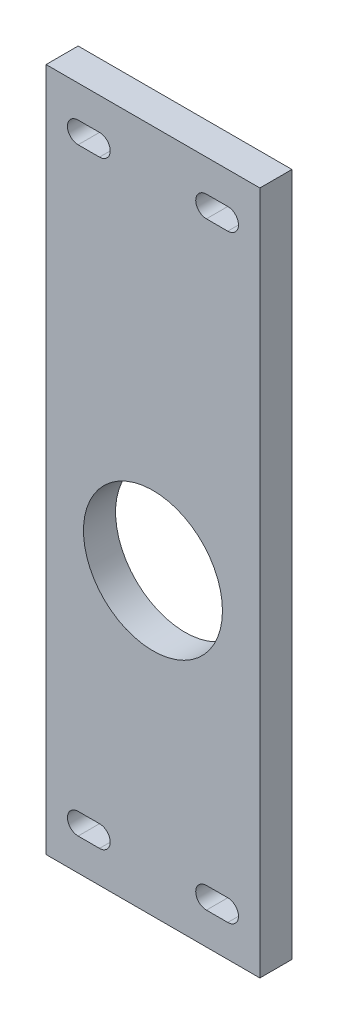
ISO-10303-21;
HEADER;
FILE_DESCRIPTION(('STEP AP214'),'2;1');
FILE_NAME('part.step','',(''),(''),'','','');
FILE_SCHEMA(('AUTOMOTIVE_DESIGN { 1 0 10303 214 1 1 1 1 }'));
ENDSEC;
DATA;
#1=APPLICATION_CONTEXT('core data for automotive mechanical design processes');
#2=APPLICATION_PROTOCOL_DEFINITION('international standard','automotive_design',2000,#1);
#3=PRODUCT_CONTEXT('',#1,'mechanical');
#4=PRODUCT('Part','Part','',(#3));
#5=PRODUCT_RELATED_PRODUCT_CATEGORY('part','',(#4));
#6=PRODUCT_DEFINITION_FORMATION('','',#4);
#7=PRODUCT_DEFINITION_CONTEXT('part definition',#1,'design');
#8=PRODUCT_DEFINITION('design','',#6,#7);
#9=PRODUCT_DEFINITION_SHAPE('','',#8);
#10=(LENGTH_UNIT() NAMED_UNIT(*) SI_UNIT(.MILLI.,.METRE.));
#11=(NAMED_UNIT(*) PLANE_ANGLE_UNIT() SI_UNIT($,.RADIAN.));
#12=(NAMED_UNIT(*) SI_UNIT($,.STERADIAN.) SOLID_ANGLE_UNIT());
#13=UNCERTAINTY_MEASURE_WITH_UNIT(LENGTH_MEASURE(1.E-05),#10,'distance_accuracy_value','');
#14=(GEOMETRIC_REPRESENTATION_CONTEXT(3) GLOBAL_UNCERTAINTY_ASSIGNED_CONTEXT((#13)) GLOBAL_UNIT_ASSIGNED_CONTEXT((#10,
#11,#12)) REPRESENTATION_CONTEXT('',''));
#15=CARTESIAN_POINT('',(0.,0.,0.));
#16=DIRECTION('',(0.,0.,1.));
#17=DIRECTION('',(1.,0.,0.));
#18=AXIS2_PLACEMENT_3D('',#15,#16,#17);
#19=CARTESIAN_POINT('',(15.875,-92.075,0.));
#20=DIRECTION('',(0.,-1.,0.));
#21=DIRECTION('',(0.,0.,-1.));
#22=AXIS2_PLACEMENT_3D('',#19,#20,#21);
#23=PLANE('',#22);
#24=DIRECTION('',(1.,0.,0.));
#25=VECTOR('',#24,1.);
#26=CARTESIAN_POINT('',(15.875,-92.075,9.525));
#27=LINE('',#26,#25);
#28=CARTESIAN_POINT('',(15.875,-92.075,9.525));
#29=VERTEX_POINT('',#28);
#30=CARTESIAN_POINT('',(22.225,-92.075,9.525));
#31=VERTEX_POINT('',#30);
#32=EDGE_CURVE('E314',#29,#31,#27,.T.);
#33=ORIENTED_EDGE('',*,*,#32,.T.);
#34=DIRECTION('',(0.,0.,1.));
#35=VECTOR('',#34,1.);
#36=CARTESIAN_POINT('',(22.225,-92.075,0.));
#37=LINE('',#36,#35);
#38=CARTESIAN_POINT('',(22.225,-92.075,0.));
#39=VERTEX_POINT('',#38);
#40=EDGE_CURVE('E11',#39,#31,#37,.T.);
#41=ORIENTED_EDGE('',*,*,#40,.F.);
#42=DIRECTION('',(1.,0.,0.));
#43=VECTOR('',#42,1.);
#44=CARTESIAN_POINT('',(15.875,-92.075,0.));
#45=LINE('',#44,#43);
#46=CARTESIAN_POINT('',(15.875,-92.075,0.));
#47=VERTEX_POINT('',#46);
#48=EDGE_CURVE('E318',#47,#39,#45,.T.);
#49=ORIENTED_EDGE('',*,*,#48,.F.);
#50=DIRECTION('',(0.,0.,1.));
#51=VECTOR('',#50,1.);
#52=CARTESIAN_POINT('',(15.875,-92.075,0.));
#53=LINE('',#52,#51);
#54=EDGE_CURVE('E323',#47,#29,#53,.T.);
#55=ORIENTED_EDGE('',*,*,#54,.T.);
#56=EDGE_LOOP('',(#33,#41,#49,#55));
#57=FACE_BOUND('',#56,.T.);
#58=ADVANCED_FACE('F32',(#57),#23,.F.);
#59=CARTESIAN_POINT('',(22.225,-88.9,0.));
#60=DIRECTION('',(0.,0.,1.));
#61=DIRECTION('',(1.,0.,0.));
#62=AXIS2_PLACEMENT_3D('',#59,#60,#61);
#63=CYLINDRICAL_SURFACE('',#62,3.175);
#64=CARTESIAN_POINT('',(22.225,-88.9,9.525));
#65=DIRECTION('',(0.,0.,1.));
#66=DIRECTION('',(1.,0.,0.));
#67=AXIS2_PLACEMENT_3D('',#64,#65,#66);
#68=CIRCLE('',#67,3.175);
#69=CARTESIAN_POINT('',(22.225,-85.725,9.525));
#70=VERTEX_POINT('',#69);
#71=EDGE_CURVE('E311',#31,#70,#68,.T.);
#72=ORIENTED_EDGE('',*,*,#71,.T.);
#73=DIRECTION('',(0.,0.,1.));
#74=VECTOR('',#73,1.);
#75=CARTESIAN_POINT('',(22.225,-85.725,0.));
#76=LINE('',#75,#74);
#77=CARTESIAN_POINT('',(22.225,-85.725,0.));
#78=VERTEX_POINT('',#77);
#79=EDGE_CURVE('E39',#78,#70,#76,.T.);
#80=ORIENTED_EDGE('',*,*,#79,.F.);
#81=CARTESIAN_POINT('',(22.225,-88.9,0.));
#82=DIRECTION('',(0.,0.,1.));
#83=DIRECTION('',(1.,0.,0.));
#84=AXIS2_PLACEMENT_3D('',#81,#82,#83);
#85=CIRCLE('',#84,3.175);
#86=EDGE_CURVE('E53',#39,#78,#85,.T.);
#87=ORIENTED_EDGE('',*,*,#86,.F.);
#88=ORIENTED_EDGE('',*,*,#40,.T.);
#89=EDGE_LOOP('',(#72,#80,#87,#88));
#90=FACE_BOUND('',#89,.T.);
#91=ADVANCED_FACE('F333',(#90),#63,.F.);
#92=CARTESIAN_POINT('',(15.875,-85.725,0.));
#93=DIRECTION('',(0.,1.,0.));
#94=DIRECTION('',(0.,0.,1.));
#95=AXIS2_PLACEMENT_3D('',#92,#93,#94);
#96=PLANE('',#95);
#97=DIRECTION('',(-1.,0.,0.));
#98=VECTOR('',#97,1.);
#99=CARTESIAN_POINT('',(15.875,-85.725,9.525));
#100=LINE('',#99,#98);
#101=CARTESIAN_POINT('',(15.875,-85.725,9.525));
#102=VERTEX_POINT('',#101);
#103=EDGE_CURVE('E308',#70,#102,#100,.T.);
#104=ORIENTED_EDGE('',*,*,#103,.T.);
#105=DIRECTION('',(0.,0.,1.));
#106=VECTOR('',#105,1.);
#107=CARTESIAN_POINT('',(15.875,-85.725,0.));
#108=LINE('',#107,#106);
#109=CARTESIAN_POINT('',(15.875,-85.725,0.));
#110=VERTEX_POINT('',#109);
#111=EDGE_CURVE('E326',#110,#102,#108,.T.);
#112=ORIENTED_EDGE('',*,*,#111,.F.);
#113=DIRECTION('',(-1.,0.,0.));
#114=VECTOR('',#113,1.);
#115=CARTESIAN_POINT('',(15.875,-85.725,0.));
#116=LINE('',#115,#114);
#117=EDGE_CURVE('E321',#78,#110,#116,.T.);
#118=ORIENTED_EDGE('',*,*,#117,.F.);
#119=ORIENTED_EDGE('',*,*,#79,.T.);
#120=EDGE_LOOP('',(#104,#112,#118,#119));
#121=FACE_BOUND('',#120,.T.);
#122=ADVANCED_FACE('F330',(#121),#96,.F.);
#123=CARTESIAN_POINT('',(15.875,-88.9,0.));
#124=DIRECTION('',(0.,0.,1.));
#125=DIRECTION('',(1.,0.,0.));
#126=AXIS2_PLACEMENT_3D('',#123,#124,#125);
#127=CYLINDRICAL_SURFACE('',#126,3.175);
#128=CARTESIAN_POINT('',(15.875,-88.9,9.525));
#129=DIRECTION('',(0.,0.,1.));
#130=DIRECTION('',(1.,0.,0.));
#131=AXIS2_PLACEMENT_3D('',#128,#129,#130);
#132=CIRCLE('',#131,3.175);
#133=EDGE_CURVE('E306',#102,#29,#132,.T.);
#134=ORIENTED_EDGE('',*,*,#133,.T.);
#135=ORIENTED_EDGE('',*,*,#54,.F.);
#136=CARTESIAN_POINT('',(15.875,-88.9,0.));
#137=DIRECTION('',(0.,0.,1.));
#138=DIRECTION('',(1.,0.,0.));
#139=AXIS2_PLACEMENT_3D('',#136,#137,#138);
#140=CIRCLE('',#139,3.175);
#141=EDGE_CURVE('E46',#110,#47,#140,.T.);
#142=ORIENTED_EDGE('',*,*,#141,.F.);
#143=ORIENTED_EDGE('',*,*,#111,.T.);
#144=EDGE_LOOP('',(#134,#135,#142,#143));
#145=FACE_BOUND('',#144,.T.);
#146=ADVANCED_FACE('F339',(#145),#127,.F.);
#147=CARTESIAN_POINT('',(-22.225,-92.075,0.));
#148=DIRECTION('',(0.,-1.,0.));
#149=DIRECTION('',(0.,0.,-1.));
#150=AXIS2_PLACEMENT_3D('',#147,#148,#149);
#151=PLANE('',#150);
#152=DIRECTION('',(1.,0.,0.));
#153=VECTOR('',#152,1.);
#154=CARTESIAN_POINT('',(-22.225,-92.075,9.525));
#155=LINE('',#154,#153);
#156=CARTESIAN_POINT('',(-22.225,-92.075,9.525));
#157=VERTEX_POINT('',#156);
#158=CARTESIAN_POINT('',(-15.875,-92.075,9.525));
#159=VERTEX_POINT('',#158);
#160=EDGE_CURVE('E282',#157,#159,#155,.T.);
#161=ORIENTED_EDGE('',*,*,#160,.T.);
#162=DIRECTION('',(0.,0.,1.));
#163=VECTOR('',#162,1.);
#164=CARTESIAN_POINT('',(-15.875,-92.075,0.));
#165=LINE('',#164,#163);
#166=CARTESIAN_POINT('',(-15.875,-92.075,0.));
#167=VERTEX_POINT('',#166);
#168=EDGE_CURVE('E303',#167,#159,#165,.T.);
#169=ORIENTED_EDGE('',*,*,#168,.F.);
#170=DIRECTION('',(1.,0.,0.));
#171=VECTOR('',#170,1.);
#172=CARTESIAN_POINT('',(-22.225,-92.075,0.));
#173=LINE('',#172,#171);
#174=CARTESIAN_POINT('',(-22.225,-92.075,0.));
#175=VERTEX_POINT('',#174);
#176=EDGE_CURVE('E287',#175,#167,#173,.T.);
#177=ORIENTED_EDGE('',*,*,#176,.F.);
#178=DIRECTION('',(0.,0.,1.));
#179=VECTOR('',#178,1.);
#180=CARTESIAN_POINT('',(-22.225,-92.075,0.));
#181=LINE('',#180,#179);
#182=EDGE_CURVE('E294',#175,#157,#181,.T.);
#183=ORIENTED_EDGE('',*,*,#182,.T.);
#184=EDGE_LOOP('',(#161,#169,#177,#183));
#185=FACE_BOUND('',#184,.T.);
#186=ADVANCED_FACE('F341',(#185),#151,.F.);
#187=CARTESIAN_POINT('',(-15.875,-88.9,0.));
#188=DIRECTION('',(0.,0.,1.));
#189=DIRECTION('',(1.,0.,0.));
#190=AXIS2_PLACEMENT_3D('',#187,#188,#189);
#191=CYLINDRICAL_SURFACE('',#190,3.175);
#192=CARTESIAN_POINT('',(-15.875,-88.9,9.525));
#193=DIRECTION('',(0.,0.,1.));
#194=DIRECTION('',(1.,0.,0.));
#195=AXIS2_PLACEMENT_3D('',#192,#193,#194);
#196=CIRCLE('',#195,3.175);
#197=CARTESIAN_POINT('',(-15.875,-85.725,9.525));
#198=VERTEX_POINT('',#197);
#199=EDGE_CURVE('E279',#159,#198,#196,.T.);
#200=ORIENTED_EDGE('',*,*,#199,.T.);
#201=DIRECTION('',(0.,0.,1.));
#202=VECTOR('',#201,1.);
#203=CARTESIAN_POINT('',(-15.875,-85.725,0.));
#204=LINE('',#203,#202);
#205=CARTESIAN_POINT('',(-15.875,-85.725,0.));
#206=VERTEX_POINT('',#205);
#207=EDGE_CURVE('E300',#206,#198,#204,.T.);
#208=ORIENTED_EDGE('',*,*,#207,.F.);
#209=CARTESIAN_POINT('',(-15.875,-88.9,0.));
#210=DIRECTION('',(0.,0.,1.));
#211=DIRECTION('',(1.,0.,0.));
#212=AXIS2_PLACEMENT_3D('',#209,#210,#211);
#213=CIRCLE('',#212,3.175);
#214=EDGE_CURVE('E289',#167,#206,#213,.T.);
#215=ORIENTED_EDGE('',*,*,#214,.F.);
#216=ORIENTED_EDGE('',*,*,#168,.T.);
#217=EDGE_LOOP('',(#200,#208,#215,#216));
#218=FACE_BOUND('',#217,.T.);
#219=ADVANCED_FACE('F347',(#218),#191,.F.);
#220=CARTESIAN_POINT('',(-22.225,-85.725,0.));
#221=DIRECTION('',(0.,1.,0.));
#222=DIRECTION('',(0.,0.,1.));
#223=AXIS2_PLACEMENT_3D('',#220,#221,#222);
#224=PLANE('',#223);
#225=DIRECTION('',(-1.,0.,0.));
#226=VECTOR('',#225,1.);
#227=CARTESIAN_POINT('',(-22.225,-85.725,9.525));
#228=LINE('',#227,#226);
#229=CARTESIAN_POINT('',(-22.225,-85.725,9.525));
#230=VERTEX_POINT('',#229);
#231=EDGE_CURVE('E276',#198,#230,#228,.T.);
#232=ORIENTED_EDGE('',*,*,#231,.T.);
#233=DIRECTION('',(0.,0.,1.));
#234=VECTOR('',#233,1.);
#235=CARTESIAN_POINT('',(-22.225,-85.725,0.));
#236=LINE('',#235,#234);
#237=CARTESIAN_POINT('',(-22.225,-85.725,0.));
#238=VERTEX_POINT('',#237);
#239=EDGE_CURVE('E297',#238,#230,#236,.T.);
#240=ORIENTED_EDGE('',*,*,#239,.F.);
#241=DIRECTION('',(-1.,0.,0.));
#242=VECTOR('',#241,1.);
#243=CARTESIAN_POINT('',(-22.225,-85.725,0.));
#244=LINE('',#243,#242);
#245=EDGE_CURVE('E291',#206,#238,#244,.T.);
#246=ORIENTED_EDGE('',*,*,#245,.F.);
#247=ORIENTED_EDGE('',*,*,#207,.T.);
#248=EDGE_LOOP('',(#232,#240,#246,#247));
#249=FACE_BOUND('',#248,.T.);
#250=ADVANCED_FACE('F380',(#249),#224,.F.);
#251=CARTESIAN_POINT('',(-22.225,-88.9,0.));
#252=DIRECTION('',(0.,0.,1.));
#253=DIRECTION('',(1.,0.,0.));
#254=AXIS2_PLACEMENT_3D('',#251,#252,#253);
#255=CYLINDRICAL_SURFACE('',#254,3.175);
#256=CARTESIAN_POINT('',(-22.225,-88.9,9.525));
#257=DIRECTION('',(0.,0.,1.));
#258=DIRECTION('',(1.,0.,0.));
#259=AXIS2_PLACEMENT_3D('',#256,#257,#258);
#260=CIRCLE('',#259,3.175);
#261=EDGE_CURVE('E274',#230,#157,#260,.T.);
#262=ORIENTED_EDGE('',*,*,#261,.T.);
#263=ORIENTED_EDGE('',*,*,#182,.F.);
#264=CARTESIAN_POINT('',(-22.225,-88.9,0.));
#265=DIRECTION('',(0.,0.,1.));
#266=DIRECTION('',(1.,0.,0.));
#267=AXIS2_PLACEMENT_3D('',#264,#265,#266);
#268=CIRCLE('',#267,3.175);
#269=EDGE_CURVE('E285',#238,#175,#268,.T.);
#270=ORIENTED_EDGE('',*,*,#269,.F.);
#271=ORIENTED_EDGE('',*,*,#239,.T.);
#272=EDGE_LOOP('',(#262,#263,#270,#271));
#273=FACE_BOUND('',#272,.T.);
#274=ADVANCED_FACE('F390',(#273),#255,.F.);
#275=CARTESIAN_POINT('',(31.75,101.6,9.525));
#276=DIRECTION('',(-1.,0.,0.));
#277=DIRECTION('',(0.,-1.,0.));
#278=AXIS2_PLACEMENT_3D('',#275,#276,#277);
#279=PLANE('',#278);
#280=DIRECTION('',(0.,1.,0.));
#281=VECTOR('',#280,1.);
#282=CARTESIAN_POINT('',(31.75,101.6,0.));
#283=LINE('',#282,#281);
#284=CARTESIAN_POINT('',(31.75,-101.6,0.));
#285=VERTEX_POINT('',#284);
#286=CARTESIAN_POINT('',(31.75,101.6,0.));
#287=VERTEX_POINT('',#286);
#288=EDGE_CURVE('E238',#285,#287,#283,.T.);
#289=ORIENTED_EDGE('',*,*,#288,.T.);
#290=DIRECTION('',(0.,0.,-1.));
#291=VECTOR('',#290,1.);
#292=CARTESIAN_POINT('',(31.75,101.6,9.525));
#293=LINE('',#292,#291);
#294=CARTESIAN_POINT('',(31.75,101.6,9.525));
#295=VERTEX_POINT('',#294);
#296=EDGE_CURVE('E271',#295,#287,#293,.T.);
#297=ORIENTED_EDGE('',*,*,#296,.F.);
#298=DIRECTION('',(0.,1.,0.));
#299=VECTOR('',#298,1.);
#300=CARTESIAN_POINT('',(31.75,101.6,9.525));
#301=LINE('',#300,#299);
#302=CARTESIAN_POINT('',(31.75,-101.6,9.525));
#303=VERTEX_POINT('',#302);
#304=EDGE_CURVE('E245',#303,#295,#301,.T.);
#305=ORIENTED_EDGE('',*,*,#304,.F.);
#306=DIRECTION('',(0.,0.,-1.));
#307=VECTOR('',#306,1.);
#308=CARTESIAN_POINT('',(31.75,-101.6,9.525));
#309=LINE('',#308,#307);
#310=EDGE_CURVE('E255',#303,#285,#309,.T.);
#311=ORIENTED_EDGE('',*,*,#310,.T.);
#312=EDGE_LOOP('',(#289,#297,#305,#311));
#313=FACE_BOUND('',#312,.T.);
#314=ADVANCED_FACE('F400',(#313),#279,.F.);
#315=CARTESIAN_POINT('',(-31.75,101.6,9.525));
#316=DIRECTION('',(0.,-1.,0.));
#317=DIRECTION('',(0.,0.,-1.));
#318=AXIS2_PLACEMENT_3D('',#315,#316,#317);
#319=PLANE('',#318);
#320=DIRECTION('',(-1.,0.,0.));
#321=VECTOR('',#320,1.);
#322=CARTESIAN_POINT('',(-31.75,101.6,0.));
#323=LINE('',#322,#321);
#324=CARTESIAN_POINT('',(-31.75,101.6,0.));
#325=VERTEX_POINT('',#324);
#326=EDGE_CURVE('E258',#287,#325,#323,.T.);
#327=ORIENTED_EDGE('',*,*,#326,.T.);
#328=DIRECTION('',(0.,0.,-1.));
#329=VECTOR('',#328,1.);
#330=CARTESIAN_POINT('',(-31.75,101.6,9.525));
#331=LINE('',#330,#329);
#332=CARTESIAN_POINT('',(-31.75,101.6,9.525));
#333=VERTEX_POINT('',#332);
#334=EDGE_CURVE('E268',#333,#325,#331,.T.);
#335=ORIENTED_EDGE('',*,*,#334,.F.);
#336=DIRECTION('',(-1.,0.,0.));
#337=VECTOR('',#336,1.);
#338=CARTESIAN_POINT('',(-31.75,101.6,9.525));
#339=LINE('',#338,#337);
#340=EDGE_CURVE('E248',#295,#333,#339,.T.);
#341=ORIENTED_EDGE('',*,*,#340,.F.);
#342=ORIENTED_EDGE('',*,*,#296,.T.);
#343=EDGE_LOOP('',(#327,#335,#341,#342));
#344=FACE_BOUND('',#343,.T.);
#345=ADVANCED_FACE('F499',(#344),#319,.F.);
#346=CARTESIAN_POINT('',(-31.75,101.6,9.525));
#347=DIRECTION('',(1.,0.,0.));
#348=DIRECTION('',(0.,1.,0.));
#349=AXIS2_PLACEMENT_3D('',#346,#347,#348);
#350=PLANE('',#349);
#351=DIRECTION('',(0.,-1.,0.));
#352=VECTOR('',#351,1.);
#353=CARTESIAN_POINT('',(-31.75,101.6,0.));
#354=LINE('',#353,#352);
#355=CARTESIAN_POINT('',(-31.75,-101.6,0.));
#356=VERTEX_POINT('',#355);
#357=EDGE_CURVE('E260',#325,#356,#354,.T.);
#358=ORIENTED_EDGE('',*,*,#357,.T.);
#359=DIRECTION('',(0.,0.,-1.));
#360=VECTOR('',#359,1.);
#361=CARTESIAN_POINT('',(-31.75,-101.6,9.525));
#362=LINE('',#361,#360);
#363=CARTESIAN_POINT('',(-31.75,-101.6,9.525));
#364=VERTEX_POINT('',#363);
#365=EDGE_CURVE('E265',#364,#356,#362,.T.);
#366=ORIENTED_EDGE('',*,*,#365,.F.);
#367=DIRECTION('',(0.,-1.,0.));
#368=VECTOR('',#367,1.);
#369=CARTESIAN_POINT('',(-31.75,101.6,9.525));
#370=LINE('',#369,#368);
#371=EDGE_CURVE('E251',#333,#364,#370,.T.);
#372=ORIENTED_EDGE('',*,*,#371,.F.);
#373=ORIENTED_EDGE('',*,*,#334,.T.);
#374=EDGE_LOOP('',(#358,#366,#372,#373));
#375=FACE_BOUND('',#374,.T.);
#376=ADVANCED_FACE('F495',(#375),#350,.F.);
#377=CARTESIAN_POINT('',(-31.75,-101.6,9.525));
#378=DIRECTION('',(0.,1.,0.));
#379=DIRECTION('',(0.,0.,1.));
#380=AXIS2_PLACEMENT_3D('',#377,#378,#379);
#381=PLANE('',#380);
#382=DIRECTION('',(1.,0.,0.));
#383=VECTOR('',#382,1.);
#384=CARTESIAN_POINT('',(-31.75,-101.6,0.));
#385=LINE('',#384,#383);
#386=EDGE_CURVE('E249',#356,#285,#385,.T.);
#387=ORIENTED_EDGE('',*,*,#386,.T.);
#388=ORIENTED_EDGE('',*,*,#310,.F.);
#389=DIRECTION('',(1.,0.,0.));
#390=VECTOR('',#389,1.);
#391=CARTESIAN_POINT('',(-31.75,-101.6,9.525));
#392=LINE('',#391,#390);
#393=EDGE_CURVE('E253',#364,#303,#392,.T.);
#394=ORIENTED_EDGE('',*,*,#393,.F.);
#395=ORIENTED_EDGE('',*,*,#365,.T.);
#396=EDGE_LOOP('',(#387,#388,#394,#395));
#397=FACE_BOUND('',#396,.T.);
#398=ADVANCED_FACE('F453',(#397),#381,.F.);
#399=CARTESIAN_POINT('',(0.,0.,9.525));
#400=DIRECTION('',(0.,0.,1.));
#401=DIRECTION('',(1.,0.,0.));
#402=AXIS2_PLACEMENT_3D('',#399,#400,#401);
#403=PLANE('',#402);
#404=CARTESIAN_POINT('',(0.,-12.7,9.525));
#405=DIRECTION('',(0.,0.,1.));
#406=DIRECTION('',(1.,0.,0.));
#407=AXIS2_PLACEMENT_3D('',#404,#405,#406);
#408=CIRCLE('',#407,20.6375);
#409=CARTESIAN_POINT('',(20.6375,-12.7,9.525));
#410=VERTEX_POINT('',#409);
#411=EDGE_CURVE('E591',#410,#410,#408,.T.);
#412=ORIENTED_EDGE('',*,*,#411,.F.);
#413=EDGE_LOOP('',(#412));
#414=FACE_BOUND('',#413,.T.);
#415=CARTESIAN_POINT('',(15.875,88.9,9.525));
#416=DIRECTION('',(0.,0.,1.));
#417=DIRECTION('',(1.,0.,0.));
#418=AXIS2_PLACEMENT_3D('',#415,#416,#417);
#419=CIRCLE('',#418,3.175);
#420=CARTESIAN_POINT('',(15.875,92.075,9.525));
#421=VERTEX_POINT('',#420);
#422=CARTESIAN_POINT('',(15.875,85.725,9.525));
#423=VERTEX_POINT('',#422);
#424=EDGE_CURVE('E207',#421,#423,#419,.T.);
#425=ORIENTED_EDGE('',*,*,#424,.F.);
#426=DIRECTION('',(-1.,0.,0.));
#427=VECTOR('',#426,1.);
#428=CARTESIAN_POINT('',(15.875,92.075,9.525));
#429=LINE('',#428,#427);
#430=CARTESIAN_POINT('',(22.225,92.075,9.525));
#431=VERTEX_POINT('',#430);
#432=EDGE_CURVE('E193',#431,#421,#429,.T.);
#433=ORIENTED_EDGE('',*,*,#432,.F.);
#434=CARTESIAN_POINT('',(22.225,88.9,9.525));
#435=DIRECTION('',(0.,0.,1.));
#436=DIRECTION('',(1.,0.,0.));
#437=AXIS2_PLACEMENT_3D('',#434,#435,#436);
#438=CIRCLE('',#437,3.175);
#439=CARTESIAN_POINT('',(22.225,85.725,9.525));
#440=VERTEX_POINT('',#439);
#441=EDGE_CURVE('E185',#440,#431,#438,.T.);
#442=ORIENTED_EDGE('',*,*,#441,.F.);
#443=DIRECTION('',(1.,0.,0.));
#444=VECTOR('',#443,1.);
#445=CARTESIAN_POINT('',(15.875,85.725,9.525));
#446=LINE('',#445,#444);
#447=EDGE_CURVE('E170',#423,#440,#446,.T.);
#448=ORIENTED_EDGE('',*,*,#447,.F.);
#449=EDGE_LOOP('',(#425,#433,#442,#448));
#450=FACE_BOUND('',#449,.T.);
#451=CARTESIAN_POINT('',(-22.225,88.9,9.525));
#452=DIRECTION('',(0.,0.,1.));
#453=DIRECTION('',(1.,0.,0.));
#454=AXIS2_PLACEMENT_3D('',#451,#452,#453);
#455=CIRCLE('',#454,3.175);
#456=CARTESIAN_POINT('',(-22.225,92.075,9.525));
#457=VERTEX_POINT('',#456);
#458=CARTESIAN_POINT('',(-22.225,85.725,9.525));
#459=VERTEX_POINT('',#458);
#460=EDGE_CURVE('E212',#457,#459,#455,.T.);
#461=ORIENTED_EDGE('',*,*,#460,.F.);
#462=DIRECTION('',(-1.,0.,0.));
#463=VECTOR('',#462,1.);
#464=CARTESIAN_POINT('',(-22.225,92.075,9.525));
#465=LINE('',#464,#463);
#466=CARTESIAN_POINT('',(-15.875,92.075,9.525));
#467=VERTEX_POINT('',#466);
#468=EDGE_CURVE('E217',#467,#457,#465,.T.);
#469=ORIENTED_EDGE('',*,*,#468,.F.);
#470=CARTESIAN_POINT('',(-15.875,88.9,9.525));
#471=DIRECTION('',(0.,0.,1.));
#472=DIRECTION('',(1.,0.,0.));
#473=AXIS2_PLACEMENT_3D('',#470,#471,#472);
#474=CIRCLE('',#473,3.175);
#475=CARTESIAN_POINT('',(-15.875,85.725,9.525));
#476=VERTEX_POINT('',#475);
#477=EDGE_CURVE('E231',#476,#467,#474,.T.);
#478=ORIENTED_EDGE('',*,*,#477,.F.);
#479=DIRECTION('',(1.,0.,0.));
#480=VECTOR('',#479,1.);
#481=CARTESIAN_POINT('',(-22.225,85.725,9.525));
#482=LINE('',#481,#480);
#483=EDGE_CURVE('E228',#459,#476,#482,.T.);
#484=ORIENTED_EDGE('',*,*,#483,.F.);
#485=EDGE_LOOP('',(#461,#469,#478,#484));
#486=FACE_BOUND('',#485,.T.);
#487=ORIENTED_EDGE('',*,*,#304,.T.);
#488=ORIENTED_EDGE('',*,*,#340,.T.);
#489=ORIENTED_EDGE('',*,*,#371,.T.);
#490=ORIENTED_EDGE('',*,*,#393,.T.);
#491=EDGE_LOOP('',(#487,#488,#489,#490));
#492=FACE_BOUND('',#491,.T.);
#493=ORIENTED_EDGE('',*,*,#261,.F.);
#494=ORIENTED_EDGE('',*,*,#231,.F.);
#495=ORIENTED_EDGE('',*,*,#199,.F.);
#496=ORIENTED_EDGE('',*,*,#160,.F.);
#497=EDGE_LOOP('',(#493,#494,#495,#496));
#498=FACE_BOUND('',#497,.T.);
#499=ORIENTED_EDGE('',*,*,#133,.F.);
#500=ORIENTED_EDGE('',*,*,#103,.F.);
#501=ORIENTED_EDGE('',*,*,#71,.F.);
#502=ORIENTED_EDGE('',*,*,#32,.F.);
#503=EDGE_LOOP('',(#499,#500,#501,#502));
#504=FACE_BOUND('',#503,.T.);
#505=ADVANCED_FACE('F191',(#414,#450,#486,#492,#498,#504),#403,.T.);
#506=CARTESIAN_POINT('',(0.,0.,0.));
#507=DIRECTION('',(0.,0.,1.));
#508=DIRECTION('',(1.,0.,0.));
#509=AXIS2_PLACEMENT_3D('',#506,#507,#508);
#510=PLANE('',#509);
#511=CARTESIAN_POINT('',(0.,-12.7,0.));
#512=DIRECTION('',(0.,0.,1.));
#513=DIRECTION('',(1.,0.,0.));
#514=AXIS2_PLACEMENT_3D('',#511,#512,#513);
#515=CIRCLE('',#514,20.6375);
#516=CARTESIAN_POINT('',(20.6375,-12.7,0.));
#517=VERTEX_POINT('',#516);
#518=EDGE_CURVE('E181',#517,#517,#515,.T.);
#519=ORIENTED_EDGE('',*,*,#518,.T.);
#520=EDGE_LOOP('',(#519));
#521=FACE_BOUND('',#520,.T.);
#522=DIRECTION('',(-1.,0.,0.));
#523=VECTOR('',#522,1.);
#524=CARTESIAN_POINT('',(15.875,92.075,0.));
#525=LINE('',#524,#523);
#526=CARTESIAN_POINT('',(22.225,92.075,0.));
#527=VERTEX_POINT('',#526);
#528=CARTESIAN_POINT('',(15.875,92.075,0.));
#529=VERTEX_POINT('',#528);
#530=EDGE_CURVE('E204',#527,#529,#525,.T.);
#531=ORIENTED_EDGE('',*,*,#530,.T.);
#532=CARTESIAN_POINT('',(15.875,88.9,0.));
#533=DIRECTION('',(0.,0.,1.));
#534=DIRECTION('',(1.,0.,0.));
#535=AXIS2_PLACEMENT_3D('',#532,#533,#534);
#536=CIRCLE('',#535,3.175);
#537=CARTESIAN_POINT('',(15.875,85.725,0.));
#538=VERTEX_POINT('',#537);
#539=EDGE_CURVE('E209',#529,#538,#536,.T.);
#540=ORIENTED_EDGE('',*,*,#539,.T.);
#541=DIRECTION('',(1.,0.,0.));
#542=VECTOR('',#541,1.);
#543=CARTESIAN_POINT('',(15.875,85.725,0.));
#544=LINE('',#543,#542);
#545=CARTESIAN_POINT('',(22.225,85.725,0.));
#546=VERTEX_POINT('',#545);
#547=EDGE_CURVE('E180',#538,#546,#544,.T.);
#548=ORIENTED_EDGE('',*,*,#547,.T.);
#549=CARTESIAN_POINT('',(22.225,88.9,0.));
#550=DIRECTION('',(0.,0.,1.));
#551=DIRECTION('',(1.,0.,0.));
#552=AXIS2_PLACEMENT_3D('',#549,#550,#551);
#553=CIRCLE('',#552,3.175);
#554=EDGE_CURVE('E188',#546,#527,#553,.T.);
#555=ORIENTED_EDGE('',*,*,#554,.T.);
#556=EDGE_LOOP('',(#531,#540,#548,#555));
#557=FACE_BOUND('',#556,.T.);
#558=DIRECTION('',(-1.,0.,0.));
#559=VECTOR('',#558,1.);
#560=CARTESIAN_POINT('',(-22.225,92.075,0.));
#561=LINE('',#560,#559);
#562=CARTESIAN_POINT('',(-15.875,92.075,0.));
#563=VERTEX_POINT('',#562);
#564=CARTESIAN_POINT('',(-22.225,92.075,0.));
#565=VERTEX_POINT('',#564);
#566=EDGE_CURVE('E223',#563,#565,#561,.T.);
#567=ORIENTED_EDGE('',*,*,#566,.T.);
#568=CARTESIAN_POINT('',(-22.225,88.9,0.));
#569=DIRECTION('',(0.,0.,1.));
#570=DIRECTION('',(1.,0.,0.));
#571=AXIS2_PLACEMENT_3D('',#568,#569,#570);
#572=CIRCLE('',#571,3.175);
#573=CARTESIAN_POINT('',(-22.225,85.725,0.));
#574=VERTEX_POINT('',#573);
#575=EDGE_CURVE('E213',#565,#574,#572,.T.);
#576=ORIENTED_EDGE('',*,*,#575,.T.);
#577=DIRECTION('',(1.,0.,0.));
#578=VECTOR('',#577,1.);
#579=CARTESIAN_POINT('',(-22.225,85.725,0.));
#580=LINE('',#579,#578);
#581=CARTESIAN_POINT('',(-15.875,85.725,0.));
#582=VERTEX_POINT('',#581);
#583=EDGE_CURVE('E216',#574,#582,#580,.T.);
#584=ORIENTED_EDGE('',*,*,#583,.T.);
#585=CARTESIAN_POINT('',(-15.875,88.9,0.));
#586=DIRECTION('',(0.,0.,1.));
#587=DIRECTION('',(1.,0.,0.));
#588=AXIS2_PLACEMENT_3D('',#585,#586,#587);
#589=CIRCLE('',#588,3.175);
#590=EDGE_CURVE('E220',#582,#563,#589,.T.);
#591=ORIENTED_EDGE('',*,*,#590,.T.);
#592=EDGE_LOOP('',(#567,#576,#584,#591));
#593=FACE_BOUND('',#592,.T.);
#594=ORIENTED_EDGE('',*,*,#288,.F.);
#595=ORIENTED_EDGE('',*,*,#386,.F.);
#596=ORIENTED_EDGE('',*,*,#357,.F.);
#597=ORIENTED_EDGE('',*,*,#326,.F.);
#598=EDGE_LOOP('',(#594,#595,#596,#597));
#599=FACE_BOUND('',#598,.T.);
#600=ORIENTED_EDGE('',*,*,#269,.T.);
#601=ORIENTED_EDGE('',*,*,#176,.T.);
#602=ORIENTED_EDGE('',*,*,#214,.T.);
#603=ORIENTED_EDGE('',*,*,#245,.T.);
#604=EDGE_LOOP('',(#600,#601,#602,#603));
#605=FACE_BOUND('',#604,.T.);
#606=ORIENTED_EDGE('',*,*,#141,.T.);
#607=ORIENTED_EDGE('',*,*,#48,.T.);
#608=ORIENTED_EDGE('',*,*,#86,.T.);
#609=ORIENTED_EDGE('',*,*,#117,.T.);
#610=EDGE_LOOP('',(#606,#607,#608,#609));
#611=FACE_BOUND('',#610,.T.);
#612=ADVANCED_FACE('F452',(#521,#557,#593,#599,#605,#611),#510,.F.);
#613=CARTESIAN_POINT('',(-22.225,88.9,0.));
#614=DIRECTION('',(0.,0.,1.));
#615=DIRECTION('',(1.,0.,0.));
#616=AXIS2_PLACEMENT_3D('',#613,#614,#615);
#617=CYLINDRICAL_SURFACE('',#616,3.175);
#618=ORIENTED_EDGE('',*,*,#460,.T.);
#619=DIRECTION('',(0.,0.,1.));
#620=VECTOR('',#619,1.);
#621=CARTESIAN_POINT('',(-22.225,85.725,0.));
#622=LINE('',#621,#620);
#623=EDGE_CURVE('E226',#574,#459,#622,.T.);
#624=ORIENTED_EDGE('',*,*,#623,.F.);
#625=ORIENTED_EDGE('',*,*,#575,.F.);
#626=DIRECTION('',(0.,0.,1.));
#627=VECTOR('',#626,1.);
#628=CARTESIAN_POINT('',(-22.225,92.075,0.));
#629=LINE('',#628,#627);
#630=EDGE_CURVE('E236',#565,#457,#629,.T.);
#631=ORIENTED_EDGE('',*,*,#630,.T.);
#632=EDGE_LOOP('',(#618,#624,#625,#631));
#633=FACE_BOUND('',#632,.T.);
#634=ADVANCED_FACE('F465',(#633),#617,.F.);
#635=CARTESIAN_POINT('',(-22.225,92.075,0.));
#636=DIRECTION('',(0.,1.,0.));
#637=DIRECTION('',(0.,0.,1.));
#638=AXIS2_PLACEMENT_3D('',#635,#636,#637);
#639=PLANE('',#638);
#640=ORIENTED_EDGE('',*,*,#468,.T.);
#641=ORIENTED_EDGE('',*,*,#630,.F.);
#642=ORIENTED_EDGE('',*,*,#566,.F.);
#643=DIRECTION('',(0.,0.,1.));
#644=VECTOR('',#643,1.);
#645=CARTESIAN_POINT('',(-15.875,92.075,0.));
#646=LINE('',#645,#644);
#647=EDGE_CURVE('E239',#563,#467,#646,.T.);
#648=ORIENTED_EDGE('',*,*,#647,.T.);
#649=EDGE_LOOP('',(#640,#641,#642,#648));
#650=FACE_BOUND('',#649,.T.);
#651=ADVANCED_FACE('F482',(#650),#639,.F.);
#652=CARTESIAN_POINT('',(-15.875,88.9,0.));
#653=DIRECTION('',(0.,0.,1.));
#654=DIRECTION('',(1.,0.,0.));
#655=AXIS2_PLACEMENT_3D('',#652,#653,#654);
#656=CYLINDRICAL_SURFACE('',#655,3.175);
#657=ORIENTED_EDGE('',*,*,#477,.T.);
#658=ORIENTED_EDGE('',*,*,#647,.F.);
#659=ORIENTED_EDGE('',*,*,#590,.F.);
#660=DIRECTION('',(0.,0.,1.));
#661=VECTOR('',#660,1.);
#662=CARTESIAN_POINT('',(-15.875,85.725,0.));
#663=LINE('',#662,#661);
#664=EDGE_CURVE('E241',#582,#476,#663,.T.);
#665=ORIENTED_EDGE('',*,*,#664,.T.);
#666=EDGE_LOOP('',(#657,#658,#659,#665));
#667=FACE_BOUND('',#666,.T.);
#668=ADVANCED_FACE('F485',(#667),#656,.F.);
#669=CARTESIAN_POINT('',(-22.225,85.725,0.));
#670=DIRECTION('',(0.,-1.,0.));
#671=DIRECTION('',(0.,0.,-1.));
#672=AXIS2_PLACEMENT_3D('',#669,#670,#671);
#673=PLANE('',#672);
#674=ORIENTED_EDGE('',*,*,#483,.T.);
#675=ORIENTED_EDGE('',*,*,#664,.F.);
#676=ORIENTED_EDGE('',*,*,#583,.F.);
#677=ORIENTED_EDGE('',*,*,#623,.T.);
#678=EDGE_LOOP('',(#674,#675,#676,#677));
#679=FACE_BOUND('',#678,.T.);
#680=ADVANCED_FACE('F413',(#679),#673,.F.);
#681=CARTESIAN_POINT('',(15.875,88.9,0.));
#682=DIRECTION('',(0.,0.,1.));
#683=DIRECTION('',(1.,0.,0.));
#684=AXIS2_PLACEMENT_3D('',#681,#682,#683);
#685=CYLINDRICAL_SURFACE('',#684,3.175);
#686=ORIENTED_EDGE('',*,*,#424,.T.);
#687=DIRECTION('',(0.,0.,1.));
#688=VECTOR('',#687,1.);
#689=CARTESIAN_POINT('',(15.875,85.725,0.));
#690=LINE('',#689,#688);
#691=EDGE_CURVE('E176',#538,#423,#690,.T.);
#692=ORIENTED_EDGE('',*,*,#691,.F.);
#693=ORIENTED_EDGE('',*,*,#539,.F.);
#694=DIRECTION('',(0.,0.,1.));
#695=VECTOR('',#694,1.);
#696=CARTESIAN_POINT('',(15.875,92.075,0.));
#697=LINE('',#696,#695);
#698=EDGE_CURVE('E201',#529,#421,#697,.T.);
#699=ORIENTED_EDGE('',*,*,#698,.T.);
#700=EDGE_LOOP('',(#686,#692,#693,#699));
#701=FACE_BOUND('',#700,.T.);
#702=ADVANCED_FACE('F408',(#701),#685,.F.);
#703=CARTESIAN_POINT('',(15.875,92.075,0.));
#704=DIRECTION('',(0.,1.,0.));
#705=DIRECTION('',(0.,0.,1.));
#706=AXIS2_PLACEMENT_3D('',#703,#704,#705);
#707=PLANE('',#706);
#708=ORIENTED_EDGE('',*,*,#432,.T.);
#709=ORIENTED_EDGE('',*,*,#698,.F.);
#710=ORIENTED_EDGE('',*,*,#530,.F.);
#711=DIRECTION('',(0.,0.,1.));
#712=VECTOR('',#711,1.);
#713=CARTESIAN_POINT('',(22.225,92.075,0.));
#714=LINE('',#713,#712);
#715=EDGE_CURVE('E194',#527,#431,#714,.T.);
#716=ORIENTED_EDGE('',*,*,#715,.T.);
#717=EDGE_LOOP('',(#708,#709,#710,#716));
#718=FACE_BOUND('',#717,.T.);
#719=ADVANCED_FACE('F412',(#718),#707,.F.);
#720=CARTESIAN_POINT('',(22.225,88.9,0.));
#721=DIRECTION('',(0.,0.,1.));
#722=DIRECTION('',(1.,0.,0.));
#723=AXIS2_PLACEMENT_3D('',#720,#721,#722);
#724=CYLINDRICAL_SURFACE('',#723,3.175);
#725=ORIENTED_EDGE('',*,*,#441,.T.);
#726=ORIENTED_EDGE('',*,*,#715,.F.);
#727=ORIENTED_EDGE('',*,*,#554,.F.);
#728=DIRECTION('',(0.,0.,1.));
#729=VECTOR('',#728,1.);
#730=CARTESIAN_POINT('',(22.225,85.725,0.));
#731=LINE('',#730,#729);
#732=EDGE_CURVE('E173',#546,#440,#731,.T.);
#733=ORIENTED_EDGE('',*,*,#732,.T.);
#734=EDGE_LOOP('',(#725,#726,#727,#733));
#735=FACE_BOUND('',#734,.T.);
#736=ADVANCED_FACE('F184',(#735),#724,.F.);
#737=CARTESIAN_POINT('',(15.875,85.725,0.));
#738=DIRECTION('',(0.,-1.,0.));
#739=DIRECTION('',(0.,0.,-1.));
#740=AXIS2_PLACEMENT_3D('',#737,#738,#739);
#741=PLANE('',#740);
#742=ORIENTED_EDGE('',*,*,#447,.T.);
#743=ORIENTED_EDGE('',*,*,#732,.F.);
#744=ORIENTED_EDGE('',*,*,#547,.F.);
#745=ORIENTED_EDGE('',*,*,#691,.T.);
#746=EDGE_LOOP('',(#742,#743,#744,#745));
#747=FACE_BOUND('',#746,.T.);
#748=ADVANCED_FACE('F172',(#747),#741,.F.);
#749=CARTESIAN_POINT('',(0.,-12.7,0.));
#750=DIRECTION('',(0.,0.,1.));
#751=DIRECTION('',(1.,0.,0.));
#752=AXIS2_PLACEMENT_3D('',#749,#750,#751);
#753=CYLINDRICAL_SURFACE('',#752,20.6375);
#754=CARTESIAN_POINT('',(20.6375,-12.7,0.));
#755=CARTESIAN_POINT('',(20.6375,-12.7,0.0992187499999999));
#756=CARTESIAN_POINT('',(20.6375,-12.7,0.1984375));
#757=CARTESIAN_POINT('',(20.6375,-12.7,0.396875));
#758=CARTESIAN_POINT('',(20.6375,-12.7,0.49609375));
#759=CARTESIAN_POINT('',(20.6375,-12.7,0.69453125));
#760=CARTESIAN_POINT('',(20.6375,-12.7,0.79375));
#761=CARTESIAN_POINT('',(20.6375,-12.7,0.9921875));
#762=CARTESIAN_POINT('',(20.6375,-12.7,1.09140625));
#763=CARTESIAN_POINT('',(20.6375,-12.7,1.28984375));
#764=CARTESIAN_POINT('',(20.6375,-12.7,1.3890625));
#765=CARTESIAN_POINT('',(20.6375,-12.7,1.5875));
#766=CARTESIAN_POINT('',(20.6375,-12.7,1.68671875));
#767=CARTESIAN_POINT('',(20.6375,-12.7,1.88515625));
#768=CARTESIAN_POINT('',(20.6375,-12.7,1.984375));
#769=CARTESIAN_POINT('',(20.6375,-12.7,2.1828125));
#770=CARTESIAN_POINT('',(20.6375,-12.7,2.28203125));
#771=CARTESIAN_POINT('',(20.6375,-12.7,2.48046875));
#772=CARTESIAN_POINT('',(20.6375,-12.7,2.5796875));
#773=CARTESIAN_POINT('',(20.6375,-12.7,2.778125));
#774=CARTESIAN_POINT('',(20.6375,-12.7,2.87734375));
#775=CARTESIAN_POINT('',(20.6375,-12.7,3.07578125));
#776=CARTESIAN_POINT('',(20.6375,-12.7,3.175));
#777=CARTESIAN_POINT('',(20.6375,-12.7,3.3734375));
#778=CARTESIAN_POINT('',(20.6375,-12.7,3.47265625));
#779=CARTESIAN_POINT('',(20.6375,-12.7,3.67109375));
#780=CARTESIAN_POINT('',(20.6375,-12.7,3.7703125));
#781=CARTESIAN_POINT('',(20.6375,-12.7,3.96875));
#782=CARTESIAN_POINT('',(20.6375,-12.7,4.06796875));
#783=CARTESIAN_POINT('',(20.6375,-12.7,4.26640625));
#784=CARTESIAN_POINT('',(20.6375,-12.7,4.365625));
#785=CARTESIAN_POINT('',(20.6375,-12.7,4.5640625));
#786=CARTESIAN_POINT('',(20.6375,-12.7,4.66328125));
#787=CARTESIAN_POINT('',(20.6375,-12.7,4.86171875));
#788=CARTESIAN_POINT('',(20.6375,-12.7,4.9609375));
#789=CARTESIAN_POINT('',(20.6375,-12.7,5.159375));
#790=CARTESIAN_POINT('',(20.6375,-12.7,5.25859375));
#791=CARTESIAN_POINT('',(20.6375,-12.7,5.45703125));
#792=CARTESIAN_POINT('',(20.6375,-12.7,5.55625));
#793=CARTESIAN_POINT('',(20.6375,-12.7,5.7546875));
#794=CARTESIAN_POINT('',(20.6375,-12.7,5.85390625));
#795=CARTESIAN_POINT('',(20.6375,-12.7,6.05234375));
#796=CARTESIAN_POINT('',(20.6375,-12.7,6.1515625));
#797=CARTESIAN_POINT('',(20.6375,-12.7,6.35));
#798=CARTESIAN_POINT('',(20.6375,-12.7,6.44921875));
#799=CARTESIAN_POINT('',(20.6375,-12.7,6.64765625));
#800=CARTESIAN_POINT('',(20.6375,-12.7,6.746875));
#801=CARTESIAN_POINT('',(20.6375,-12.7,6.9453125));
#802=CARTESIAN_POINT('',(20.6375,-12.7,7.04453125));
#803=CARTESIAN_POINT('',(20.6375,-12.7,7.24296875));
#804=CARTESIAN_POINT('',(20.6375,-12.7,7.3421875));
#805=CARTESIAN_POINT('',(20.6375,-12.7,7.540625));
#806=CARTESIAN_POINT('',(20.6375,-12.7,7.63984375));
#807=CARTESIAN_POINT('',(20.6375,-12.7,7.83828125));
#808=CARTESIAN_POINT('',(20.6375,-12.7,7.9375));
#809=CARTESIAN_POINT('',(20.6375,-12.7,8.1359375));
#810=CARTESIAN_POINT('',(20.6375,-12.7,8.23515625));
#811=CARTESIAN_POINT('',(20.6375,-12.7,8.43359375));
#812=CARTESIAN_POINT('',(20.6375,-12.7,8.5328125));
#813=CARTESIAN_POINT('',(20.6375,-12.7,8.73125));
#814=CARTESIAN_POINT('',(20.6375,-12.7,8.83046875));
#815=CARTESIAN_POINT('',(20.6375,-12.7,9.02890625));
#816=CARTESIAN_POINT('',(20.6375,-12.7,9.128125));
#817=CARTESIAN_POINT('',(20.6375,-12.7,9.3265625));
#818=CARTESIAN_POINT('',(20.6375,-12.7,9.42578125));
#819=CARTESIAN_POINT('',(20.6375,-12.7,9.525));
#820=B_SPLINE_CURVE_WITH_KNOTS('',3,(#754,#755,#756,#757,#758,#759,#760,#761,#762,#763,#764,
#765,#766,#767,#768,#769,#770,#771,#772,#773,#774,#775,#776,#777,#778,#779,#780,#781,#782,#783,
#784,#785,#786,#787,#788,#789,#790,#791,#792,#793,#794,#795,#796,#797,#798,#799,#800,#801,#802,
#803,#804,#805,#806,#807,#808,#809,#810,#811,#812,#813,#814,#815,#816,#817,#818,#819),
.UNSPECIFIED.,.F.,.F.,(4,2,2,2,2,2,2,2,2,2,2,2,2,2,2,2,2,2,2,2,2,2,2,2,2,2,2,2,2,2,2,2,4),(0.,
0.29765625,0.5953125,0.89296875,1.190625,1.48828125,1.7859375,2.08359375,2.38125,2.67890625,
2.9765625,3.27421875,3.571875,3.86953125,4.1671875,4.46484375,4.7625,5.06015625,5.3578125,
5.65546875,5.953125,6.25078125,6.5484375,6.84609375,7.14375,7.44140625,7.7390625,8.03671875,
8.334375,8.63203125,8.9296875,9.22734375,9.525),.UNSPECIFIED.);
#821=EDGE_CURVE('BSEAM441',#517,#410,#820,.T.);
#822=ORIENTED_EDGE('',*,*,#518,.F.);
#823=ORIENTED_EDGE('',*,*,#411,.T.);
#824=ORIENTED_EDGE('',*,*,#821,.T.);
#825=ORIENTED_EDGE('',*,*,#821,.F.);
#826=EDGE_LOOP('',(#822,#824,#823,#825));
#827=FACE_BOUND('',#826,.T.);
#828=ADVANCED_FACE('F441',(#827),#753,.F.);
#829=CLOSED_SHELL('',(#58,#91,#122,#146,#186,#219,#250,#274,#314,#345,#376,#398,#505,#612,#634,
#651,#668,#680,#702,#719,#736,#748,#828));
#830=MANIFOLD_SOLID_BREP('B2',#829);
#831=ADVANCED_BREP_SHAPE_REPRESENTATION('',(#18,#830),#14);
#832=SHAPE_DEFINITION_REPRESENTATION(#9,#831);
ENDSEC;
END-ISO-10303-21;
